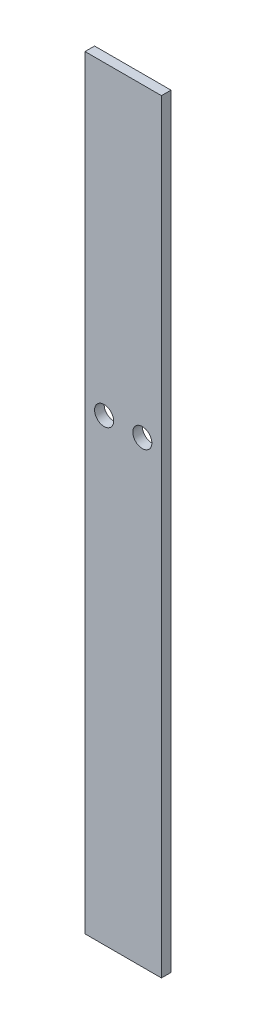
ISO-10303-21;
HEADER;
FILE_DESCRIPTION(('STEP AP214'),'2;1');
FILE_NAME('part.step','',(''),(''),'','','');
FILE_SCHEMA(('AUTOMOTIVE_DESIGN { 1 0 10303 214 1 1 1 1 }'));
ENDSEC;
DATA;
#1=APPLICATION_CONTEXT('core data for automotive mechanical design processes');
#2=APPLICATION_PROTOCOL_DEFINITION('international standard','automotive_design',2000,#1);
#3=PRODUCT_CONTEXT('',#1,'mechanical');
#4=PRODUCT('Part','Part','',(#3));
#5=PRODUCT_RELATED_PRODUCT_CATEGORY('part','',(#4));
#6=PRODUCT_DEFINITION_FORMATION('','',#4);
#7=PRODUCT_DEFINITION_CONTEXT('part definition',#1,'design');
#8=PRODUCT_DEFINITION('design','',#6,#7);
#9=PRODUCT_DEFINITION_SHAPE('','',#8);
#10=(LENGTH_UNIT() NAMED_UNIT(*) SI_UNIT(.MILLI.,.METRE.));
#11=(NAMED_UNIT(*) PLANE_ANGLE_UNIT() SI_UNIT($,.RADIAN.));
#12=(NAMED_UNIT(*) SI_UNIT($,.STERADIAN.) SOLID_ANGLE_UNIT());
#13=UNCERTAINTY_MEASURE_WITH_UNIT(LENGTH_MEASURE(1.E-05),#10,'distance_accuracy_value','');
#14=(GEOMETRIC_REPRESENTATION_CONTEXT(3) GLOBAL_UNCERTAINTY_ASSIGNED_CONTEXT((#13)) GLOBAL_UNIT_ASSIGNED_CONTEXT((#10,
#11,#12)) REPRESENTATION_CONTEXT('',''));
#15=CARTESIAN_POINT('',(0.,0.,0.));
#16=DIRECTION('',(0.,0.,1.));
#17=DIRECTION('',(1.,0.,0.));
#18=AXIS2_PLACEMENT_3D('',#15,#16,#17);
#19=CARTESIAN_POINT('',(0.,0.,4.7625));
#20=DIRECTION('',(0.,0.,-1.));
#21=DIRECTION('',(-1.,0.,0.));
#22=AXIS2_PLACEMENT_3D('',#19,#20,#21);
#23=PLANE('',#22);
#24=DIRECTION('',(0.,-1.,0.));
#25=VECTOR('',#24,1.);
#26=CARTESIAN_POINT('',(0.,0.,4.7625));
#27=LINE('',#26,#25);
#28=CARTESIAN_POINT('',(0.,381.,4.7625));
#29=VERTEX_POINT('',#28);
#30=CARTESIAN_POINT('',(0.,0.,4.7625));
#31=VERTEX_POINT('',#30);
#32=EDGE_CURVE('E96',#29,#31,#27,.T.);
#33=ORIENTED_EDGE('',*,*,#32,.T.);
#34=DIRECTION('',(1.,0.,0.));
#35=VECTOR('',#34,1.);
#36=CARTESIAN_POINT('',(0.,0.,4.7625));
#37=LINE('',#36,#35);
#38=CARTESIAN_POINT('',(38.1,0.,4.7625));
#39=VERTEX_POINT('',#38);
#40=EDGE_CURVE('E91',#31,#39,#37,.T.);
#41=ORIENTED_EDGE('',*,*,#40,.T.);
#42=DIRECTION('',(0.,1.,0.));
#43=VECTOR('',#42,1.);
#44=CARTESIAN_POINT('',(38.1,0.,4.7625));
#45=LINE('',#44,#43);
#46=CARTESIAN_POINT('',(38.1,381.,4.7625));
#47=VERTEX_POINT('',#46);
#48=EDGE_CURVE('E94',#39,#47,#45,.T.);
#49=ORIENTED_EDGE('',*,*,#48,.T.);
#50=DIRECTION('',(-1.,0.,0.));
#51=VECTOR('',#50,1.);
#52=CARTESIAN_POINT('',(0.,381.,4.7625));
#53=LINE('',#52,#51);
#54=EDGE_CURVE('E61',#47,#29,#53,.T.);
#55=ORIENTED_EDGE('',*,*,#54,.T.);
#56=EDGE_LOOP('',(#33,#41,#49,#55));
#57=FACE_BOUND('',#56,.T.);
#58=CARTESIAN_POINT('',(9.525,228.6,4.7625));
#59=DIRECTION('',(0.,0.,1.));
#60=DIRECTION('',(1.,0.,0.));
#61=AXIS2_PLACEMENT_3D('',#58,#59,#60);
#62=CIRCLE('',#61,4.7625);
#63=CARTESIAN_POINT('',(4.7625,228.6,4.7625));
#64=VERTEX_POINT('',#63);
#65=EDGE_CURVE('E116',#64,#64,#62,.T.);
#66=ORIENTED_EDGE('',*,*,#65,.F.);
#67=EDGE_LOOP('',(#66));
#68=FACE_BOUND('',#67,.T.);
#69=CARTESIAN_POINT('',(28.575,228.6,4.7625));
#70=DIRECTION('',(0.,0.,1.));
#71=DIRECTION('',(1.,0.,0.));
#72=AXIS2_PLACEMENT_3D('',#69,#70,#71);
#73=CIRCLE('',#72,4.7625);
#74=CARTESIAN_POINT('',(23.8125,228.6,4.7625));
#75=VERTEX_POINT('',#74);
#76=EDGE_CURVE('E138',#75,#75,#73,.T.);
#77=ORIENTED_EDGE('',*,*,#76,.F.);
#78=EDGE_LOOP('',(#77));
#79=FACE_BOUND('',#78,.T.);
#80=ADVANCED_FACE('F43',(#57,#68,#79),#23,.F.);
#81=CARTESIAN_POINT('',(0.,0.,0.));
#82=DIRECTION('',(0.,0.,-1.));
#83=DIRECTION('',(-1.,0.,0.));
#84=AXIS2_PLACEMENT_3D('',#81,#82,#83);
#85=PLANE('',#84);
#86=CARTESIAN_POINT('',(9.525,228.6,0.));
#87=DIRECTION('',(0.,0.,1.));
#88=DIRECTION('',(1.,0.,0.));
#89=AXIS2_PLACEMENT_3D('',#86,#87,#88);
#90=CIRCLE('',#89,4.7625);
#91=CARTESIAN_POINT('',(4.7625,228.6,0.));
#92=VERTEX_POINT('',#91);
#93=EDGE_CURVE('E134',#92,#92,#90,.T.);
#94=ORIENTED_EDGE('',*,*,#93,.T.);
#95=EDGE_LOOP('',(#94));
#96=FACE_BOUND('',#95,.T.);
#97=DIRECTION('',(0.,-1.,0.));
#98=VECTOR('',#97,1.);
#99=CARTESIAN_POINT('',(0.,0.,0.));
#100=LINE('',#99,#98);
#101=CARTESIAN_POINT('',(0.,381.,0.));
#102=VERTEX_POINT('',#101);
#103=CARTESIAN_POINT('',(0.,0.,0.));
#104=VERTEX_POINT('',#103);
#105=EDGE_CURVE('E112',#102,#104,#100,.T.);
#106=ORIENTED_EDGE('',*,*,#105,.F.);
#107=DIRECTION('',(-1.,0.,0.));
#108=VECTOR('',#107,1.);
#109=CARTESIAN_POINT('',(0.,381.,0.));
#110=LINE('',#109,#108);
#111=CARTESIAN_POINT('',(38.1,381.,0.));
#112=VERTEX_POINT('',#111);
#113=EDGE_CURVE('E84',#112,#102,#110,.T.);
#114=ORIENTED_EDGE('',*,*,#113,.F.);
#115=DIRECTION('',(0.,1.,0.));
#116=VECTOR('',#115,1.);
#117=CARTESIAN_POINT('',(38.1,0.,0.));
#118=LINE('',#117,#116);
#119=CARTESIAN_POINT('',(38.1,0.,0.));
#120=VERTEX_POINT('',#119);
#121=EDGE_CURVE('E78',#120,#112,#118,.T.);
#122=ORIENTED_EDGE('',*,*,#121,.F.);
#123=DIRECTION('',(1.,0.,0.));
#124=VECTOR('',#123,1.);
#125=CARTESIAN_POINT('',(0.,0.,0.));
#126=LINE('',#125,#124);
#127=EDGE_CURVE('E101',#104,#120,#126,.T.);
#128=ORIENTED_EDGE('',*,*,#127,.F.);
#129=EDGE_LOOP('',(#106,#114,#122,#128));
#130=FACE_BOUND('',#129,.T.);
#131=CARTESIAN_POINT('',(28.575,228.6,0.));
#132=DIRECTION('',(0.,0.,1.));
#133=DIRECTION('',(1.,0.,0.));
#134=AXIS2_PLACEMENT_3D('',#131,#132,#133);
#135=CIRCLE('',#134,4.7625);
#136=CARTESIAN_POINT('',(23.8125,228.6,0.));
#137=VERTEX_POINT('',#136);
#138=EDGE_CURVE('E142',#137,#137,#135,.T.);
#139=ORIENTED_EDGE('',*,*,#138,.T.);
#140=EDGE_LOOP('',(#139));
#141=FACE_BOUND('',#140,.T.);
#142=ADVANCED_FACE('F129',(#96,#130,#141),#85,.T.);
#143=CARTESIAN_POINT('',(0.,0.,4.7625));
#144=DIRECTION('',(1.,0.,0.));
#145=DIRECTION('',(0.,0.,-1.));
#146=AXIS2_PLACEMENT_3D('',#143,#144,#145);
#147=PLANE('',#146);
#148=ORIENTED_EDGE('',*,*,#105,.T.);
#149=DIRECTION('',(0.,0.,-1.));
#150=VECTOR('',#149,1.);
#151=CARTESIAN_POINT('',(0.,0.,4.7625));
#152=LINE('',#151,#150);
#153=EDGE_CURVE('E11',#31,#104,#152,.T.);
#154=ORIENTED_EDGE('',*,*,#153,.F.);
#155=ORIENTED_EDGE('',*,*,#32,.F.);
#156=DIRECTION('',(0.,0.,-1.));
#157=VECTOR('',#156,1.);
#158=CARTESIAN_POINT('',(0.,381.,4.7625));
#159=LINE('',#158,#157);
#160=EDGE_CURVE('E108',#29,#102,#159,.T.);
#161=ORIENTED_EDGE('',*,*,#160,.T.);
#162=EDGE_LOOP('',(#148,#154,#155,#161));
#163=FACE_BOUND('',#162,.T.);
#164=ADVANCED_FACE('F45',(#163),#147,.F.);
#165=CARTESIAN_POINT('',(0.,0.,4.7625));
#166=DIRECTION('',(0.,1.,0.));
#167=DIRECTION('',(0.,0.,1.));
#168=AXIS2_PLACEMENT_3D('',#165,#166,#167);
#169=PLANE('',#168);
#170=ORIENTED_EDGE('',*,*,#127,.T.);
#171=DIRECTION('',(0.,0.,-1.));
#172=VECTOR('',#171,1.);
#173=CARTESIAN_POINT('',(38.1,0.,4.7625));
#174=LINE('',#173,#172);
#175=EDGE_CURVE('E53',#39,#120,#174,.T.);
#176=ORIENTED_EDGE('',*,*,#175,.F.);
#177=ORIENTED_EDGE('',*,*,#40,.F.);
#178=ORIENTED_EDGE('',*,*,#153,.T.);
#179=EDGE_LOOP('',(#170,#176,#177,#178));
#180=FACE_BOUND('',#179,.T.);
#181=ADVANCED_FACE('F100',(#180),#169,.F.);
#182=CARTESIAN_POINT('',(38.1,0.,4.7625));
#183=DIRECTION('',(-1.,0.,0.));
#184=DIRECTION('',(0.,-1.,0.));
#185=AXIS2_PLACEMENT_3D('',#182,#183,#184);
#186=PLANE('',#185);
#187=ORIENTED_EDGE('',*,*,#121,.T.);
#188=DIRECTION('',(0.,0.,-1.));
#189=VECTOR('',#188,1.);
#190=CARTESIAN_POINT('',(38.1,381.,4.7625));
#191=LINE('',#190,#189);
#192=EDGE_CURVE('E103',#47,#112,#191,.T.);
#193=ORIENTED_EDGE('',*,*,#192,.F.);
#194=ORIENTED_EDGE('',*,*,#48,.F.);
#195=ORIENTED_EDGE('',*,*,#175,.T.);
#196=EDGE_LOOP('',(#187,#193,#194,#195));
#197=FACE_BOUND('',#196,.T.);
#198=ADVANCED_FACE('F104',(#197),#186,.F.);
#199=CARTESIAN_POINT('',(0.,381.,4.7625));
#200=DIRECTION('',(0.,-1.,0.));
#201=DIRECTION('',(0.,0.,-1.));
#202=AXIS2_PLACEMENT_3D('',#199,#200,#201);
#203=PLANE('',#202);
#204=ORIENTED_EDGE('',*,*,#113,.T.);
#205=ORIENTED_EDGE('',*,*,#160,.F.);
#206=ORIENTED_EDGE('',*,*,#54,.F.);
#207=ORIENTED_EDGE('',*,*,#192,.T.);
#208=EDGE_LOOP('',(#204,#205,#206,#207));
#209=FACE_BOUND('',#208,.T.);
#210=ADVANCED_FACE('F126',(#209),#203,.F.);
#211=CARTESIAN_POINT('',(9.525,228.6,4.7625));
#212=DIRECTION('',(0.,0.,-1.));
#213=DIRECTION('',(-1.,0.,0.));
#214=AXIS2_PLACEMENT_3D('',#211,#212,#213);
#215=CYLINDRICAL_SURFACE('',#214,4.7625);
#216=CARTESIAN_POINT('',(4.7625,228.6,4.7625));
#217=CARTESIAN_POINT('',(4.7625,228.6,4.712890625));
#218=CARTESIAN_POINT('',(4.7625,228.6,4.66328125));
#219=CARTESIAN_POINT('',(4.7625,228.6,4.5640625));
#220=CARTESIAN_POINT('',(4.7625,228.6,4.514453125));
#221=CARTESIAN_POINT('',(4.7625,228.6,4.415234375));
#222=CARTESIAN_POINT('',(4.7625,228.6,4.365625));
#223=CARTESIAN_POINT('',(4.7625,228.6,4.26640625));
#224=CARTESIAN_POINT('',(4.7625,228.6,4.216796875));
#225=CARTESIAN_POINT('',(4.7625,228.6,4.117578125));
#226=CARTESIAN_POINT('',(4.7625,228.6,4.06796875));
#227=CARTESIAN_POINT('',(4.7625,228.6,3.96875));
#228=CARTESIAN_POINT('',(4.7625,228.6,3.919140625));
#229=CARTESIAN_POINT('',(4.7625,228.6,3.819921875));
#230=CARTESIAN_POINT('',(4.7625,228.6,3.7703125));
#231=CARTESIAN_POINT('',(4.7625,228.6,3.67109375));
#232=CARTESIAN_POINT('',(4.7625,228.6,3.621484375));
#233=CARTESIAN_POINT('',(4.7625,228.6,3.522265625));
#234=CARTESIAN_POINT('',(4.7625,228.6,3.47265625));
#235=CARTESIAN_POINT('',(4.7625,228.6,3.3734375));
#236=CARTESIAN_POINT('',(4.7625,228.6,3.323828125));
#237=CARTESIAN_POINT('',(4.7625,228.6,3.224609375));
#238=CARTESIAN_POINT('',(4.7625,228.6,3.175));
#239=CARTESIAN_POINT('',(4.7625,228.6,3.07578125));
#240=CARTESIAN_POINT('',(4.7625,228.6,3.026171875));
#241=CARTESIAN_POINT('',(4.7625,228.6,2.926953125));
#242=CARTESIAN_POINT('',(4.7625,228.6,2.87734375));
#243=CARTESIAN_POINT('',(4.7625,228.6,2.778125));
#244=CARTESIAN_POINT('',(4.7625,228.6,2.728515625));
#245=CARTESIAN_POINT('',(4.7625,228.6,2.629296875));
#246=CARTESIAN_POINT('',(4.7625,228.6,2.5796875));
#247=CARTESIAN_POINT('',(4.7625,228.6,2.48046875));
#248=CARTESIAN_POINT('',(4.7625,228.6,2.430859375));
#249=CARTESIAN_POINT('',(4.7625,228.6,2.331640625));
#250=CARTESIAN_POINT('',(4.7625,228.6,2.28203125));
#251=CARTESIAN_POINT('',(4.7625,228.6,2.1828125));
#252=CARTESIAN_POINT('',(4.7625,228.6,2.133203125));
#253=CARTESIAN_POINT('',(4.7625,228.6,2.033984375));
#254=CARTESIAN_POINT('',(4.7625,228.6,1.984375));
#255=CARTESIAN_POINT('',(4.7625,228.6,1.88515625));
#256=CARTESIAN_POINT('',(4.7625,228.6,1.835546875));
#257=CARTESIAN_POINT('',(4.7625,228.6,1.736328125));
#258=CARTESIAN_POINT('',(4.7625,228.6,1.68671875));
#259=CARTESIAN_POINT('',(4.7625,228.6,1.5875));
#260=CARTESIAN_POINT('',(4.7625,228.6,1.537890625));
#261=CARTESIAN_POINT('',(4.7625,228.6,1.438671875));
#262=CARTESIAN_POINT('',(4.7625,228.6,1.3890625));
#263=CARTESIAN_POINT('',(4.7625,228.6,1.28984375));
#264=CARTESIAN_POINT('',(4.7625,228.6,1.240234375));
#265=CARTESIAN_POINT('',(4.7625,228.6,1.141015625));
#266=CARTESIAN_POINT('',(4.7625,228.6,1.09140625));
#267=CARTESIAN_POINT('',(4.7625,228.6,0.992187499999999));
#268=CARTESIAN_POINT('',(4.7625,228.6,0.942578124999999));
#269=CARTESIAN_POINT('',(4.7625,228.6,0.843359375));
#270=CARTESIAN_POINT('',(4.7625,228.6,0.79375));
#271=CARTESIAN_POINT('',(4.7625,228.6,0.69453125));
#272=CARTESIAN_POINT('',(4.7625,228.6,0.644921875));
#273=CARTESIAN_POINT('',(4.7625,228.6,0.545703125));
#274=CARTESIAN_POINT('',(4.7625,228.6,0.49609375));
#275=CARTESIAN_POINT('',(4.7625,228.6,0.396875));
#276=CARTESIAN_POINT('',(4.7625,228.6,0.347265625));
#277=CARTESIAN_POINT('',(4.7625,228.6,0.248046875));
#278=CARTESIAN_POINT('',(4.7625,228.6,0.1984375));
#279=CARTESIAN_POINT('',(4.7625,228.6,0.09921875));
#280=CARTESIAN_POINT('',(4.7625,228.6,0.049609375));
#281=CARTESIAN_POINT('',(4.7625,228.6,0.));
#282=B_SPLINE_CURVE_WITH_KNOTS('',3,(#216,#217,#218,#219,#220,#221,#222,#223,#224,#225,#226,
#227,#228,#229,#230,#231,#232,#233,#234,#235,#236,#237,#238,#239,#240,#241,#242,#243,#244,#245,
#246,#247,#248,#249,#250,#251,#252,#253,#254,#255,#256,#257,#258,#259,#260,#261,#262,#263,#264,
#265,#266,#267,#268,#269,#270,#271,#272,#273,#274,#275,#276,#277,#278,#279,#280,#281),
.UNSPECIFIED.,.F.,.F.,(4,2,2,2,2,2,2,2,2,2,2,2,2,2,2,2,2,2,2,2,2,2,2,2,2,2,2,2,2,2,2,2,4),(0.,
0.148828125,0.29765625,0.446484375,0.5953125,0.744140625,0.892968750000001,1.041796875,1.190625,
1.339453125,1.48828125,1.637109375,1.7859375,1.934765625,2.08359375,2.232421875,2.38125,
2.530078125,2.67890625,2.827734375,2.9765625,3.125390625,3.27421875,3.423046875,3.571875,
3.720703125,3.86953125,4.018359375,4.1671875,4.316015625,4.46484375,4.613671875,4.7625),.UNSPECIFIED.);
#283=EDGE_CURVE('BSEAM161',#64,#92,#282,.T.);
#284=ORIENTED_EDGE('',*,*,#65,.T.);
#285=ORIENTED_EDGE('',*,*,#93,.F.);
#286=ORIENTED_EDGE('',*,*,#283,.T.);
#287=ORIENTED_EDGE('',*,*,#283,.F.);
#288=EDGE_LOOP('',(#284,#286,#285,#287));
#289=FACE_BOUND('',#288,.T.);
#290=ADVANCED_FACE('F161',(#289),#215,.F.);
#291=CARTESIAN_POINT('',(28.575,228.6,4.7625));
#292=DIRECTION('',(0.,0.,-1.));
#293=DIRECTION('',(-1.,0.,0.));
#294=AXIS2_PLACEMENT_3D('',#291,#292,#293);
#295=CYLINDRICAL_SURFACE('',#294,4.7625);
#296=CARTESIAN_POINT('',(23.8125,228.6,4.7625));
#297=CARTESIAN_POINT('',(23.8125,228.6,4.712890625));
#298=CARTESIAN_POINT('',(23.8125,228.6,4.66328125));
#299=CARTESIAN_POINT('',(23.8125,228.6,4.5640625));
#300=CARTESIAN_POINT('',(23.8125,228.6,4.514453125));
#301=CARTESIAN_POINT('',(23.8125,228.6,4.415234375));
#302=CARTESIAN_POINT('',(23.8125,228.6,4.365625));
#303=CARTESIAN_POINT('',(23.8125,228.6,4.26640625));
#304=CARTESIAN_POINT('',(23.8125,228.6,4.216796875));
#305=CARTESIAN_POINT('',(23.8125,228.6,4.117578125));
#306=CARTESIAN_POINT('',(23.8125,228.6,4.06796875));
#307=CARTESIAN_POINT('',(23.8125,228.6,3.96875));
#308=CARTESIAN_POINT('',(23.8125,228.6,3.919140625));
#309=CARTESIAN_POINT('',(23.8125,228.6,3.819921875));
#310=CARTESIAN_POINT('',(23.8125,228.6,3.7703125));
#311=CARTESIAN_POINT('',(23.8125,228.6,3.67109375));
#312=CARTESIAN_POINT('',(23.8125,228.6,3.621484375));
#313=CARTESIAN_POINT('',(23.8125,228.6,3.522265625));
#314=CARTESIAN_POINT('',(23.8125,228.6,3.47265625));
#315=CARTESIAN_POINT('',(23.8125,228.6,3.3734375));
#316=CARTESIAN_POINT('',(23.8125,228.6,3.323828125));
#317=CARTESIAN_POINT('',(23.8125,228.6,3.224609375));
#318=CARTESIAN_POINT('',(23.8125,228.6,3.175));
#319=CARTESIAN_POINT('',(23.8125,228.6,3.07578125));
#320=CARTESIAN_POINT('',(23.8125,228.6,3.026171875));
#321=CARTESIAN_POINT('',(23.8125,228.6,2.926953125));
#322=CARTESIAN_POINT('',(23.8125,228.6,2.87734375));
#323=CARTESIAN_POINT('',(23.8125,228.6,2.778125));
#324=CARTESIAN_POINT('',(23.8125,228.6,2.728515625));
#325=CARTESIAN_POINT('',(23.8125,228.6,2.629296875));
#326=CARTESIAN_POINT('',(23.8125,228.6,2.5796875));
#327=CARTESIAN_POINT('',(23.8125,228.6,2.48046875));
#328=CARTESIAN_POINT('',(23.8125,228.6,2.430859375));
#329=CARTESIAN_POINT('',(23.8125,228.6,2.331640625));
#330=CARTESIAN_POINT('',(23.8125,228.6,2.28203125));
#331=CARTESIAN_POINT('',(23.8125,228.6,2.1828125));
#332=CARTESIAN_POINT('',(23.8125,228.6,2.133203125));
#333=CARTESIAN_POINT('',(23.8125,228.6,2.033984375));
#334=CARTESIAN_POINT('',(23.8125,228.6,1.984375));
#335=CARTESIAN_POINT('',(23.8125,228.6,1.88515625));
#336=CARTESIAN_POINT('',(23.8125,228.6,1.835546875));
#337=CARTESIAN_POINT('',(23.8125,228.6,1.736328125));
#338=CARTESIAN_POINT('',(23.8125,228.6,1.68671875));
#339=CARTESIAN_POINT('',(23.8125,228.6,1.5875));
#340=CARTESIAN_POINT('',(23.8125,228.6,1.537890625));
#341=CARTESIAN_POINT('',(23.8125,228.6,1.438671875));
#342=CARTESIAN_POINT('',(23.8125,228.6,1.3890625));
#343=CARTESIAN_POINT('',(23.8125,228.6,1.28984375));
#344=CARTESIAN_POINT('',(23.8125,228.6,1.240234375));
#345=CARTESIAN_POINT('',(23.8125,228.6,1.141015625));
#346=CARTESIAN_POINT('',(23.8125,228.6,1.09140625));
#347=CARTESIAN_POINT('',(23.8125,228.6,0.992187499999999));
#348=CARTESIAN_POINT('',(23.8125,228.6,0.942578124999999));
#349=CARTESIAN_POINT('',(23.8125,228.6,0.843359375));
#350=CARTESIAN_POINT('',(23.8125,228.6,0.79375));
#351=CARTESIAN_POINT('',(23.8125,228.6,0.69453125));
#352=CARTESIAN_POINT('',(23.8125,228.6,0.644921875));
#353=CARTESIAN_POINT('',(23.8125,228.6,0.545703125));
#354=CARTESIAN_POINT('',(23.8125,228.6,0.49609375));
#355=CARTESIAN_POINT('',(23.8125,228.6,0.396875));
#356=CARTESIAN_POINT('',(23.8125,228.6,0.347265625));
#357=CARTESIAN_POINT('',(23.8125,228.6,0.248046875));
#358=CARTESIAN_POINT('',(23.8125,228.6,0.1984375));
#359=CARTESIAN_POINT('',(23.8125,228.6,0.09921875));
#360=CARTESIAN_POINT('',(23.8125,228.6,0.049609375));
#361=CARTESIAN_POINT('',(23.8125,228.6,0.));
#362=B_SPLINE_CURVE_WITH_KNOTS('',3,(#296,#297,#298,#299,#300,#301,#302,#303,#304,#305,#306,
#307,#308,#309,#310,#311,#312,#313,#314,#315,#316,#317,#318,#319,#320,#321,#322,#323,#324,#325,
#326,#327,#328,#329,#330,#331,#332,#333,#334,#335,#336,#337,#338,#339,#340,#341,#342,#343,#344,
#345,#346,#347,#348,#349,#350,#351,#352,#353,#354,#355,#356,#357,#358,#359,#360,#361),
.UNSPECIFIED.,.F.,.F.,(4,2,2,2,2,2,2,2,2,2,2,2,2,2,2,2,2,2,2,2,2,2,2,2,2,2,2,2,2,2,2,2,4),(0.,
0.148828125,0.29765625,0.446484375,0.5953125,0.744140625,0.892968750000001,1.041796875,1.190625,
1.339453125,1.48828125,1.637109375,1.7859375,1.934765625,2.08359375,2.232421875,2.38125,
2.530078125,2.67890625,2.827734375,2.9765625,3.125390625,3.27421875,3.423046875,3.571875,
3.720703125,3.86953125,4.018359375,4.1671875,4.316015625,4.46484375,4.613671875,4.7625),.UNSPECIFIED.);
#363=EDGE_CURVE('BSEAM150',#75,#137,#362,.T.);
#364=ORIENTED_EDGE('',*,*,#76,.T.);
#365=ORIENTED_EDGE('',*,*,#138,.F.);
#366=ORIENTED_EDGE('',*,*,#363,.T.);
#367=ORIENTED_EDGE('',*,*,#363,.F.);
#368=EDGE_LOOP('',(#364,#366,#365,#367));
#369=FACE_BOUND('',#368,.T.);
#370=ADVANCED_FACE('F150',(#369),#295,.F.);
#371=CLOSED_SHELL('',(#80,#142,#164,#181,#198,#210,#290,#370));
#372=MANIFOLD_SOLID_BREP('B2',#371);
#373=ADVANCED_BREP_SHAPE_REPRESENTATION('',(#18,#372),#14);
#374=SHAPE_DEFINITION_REPRESENTATION(#9,#373);
ENDSEC;
END-ISO-10303-21;
